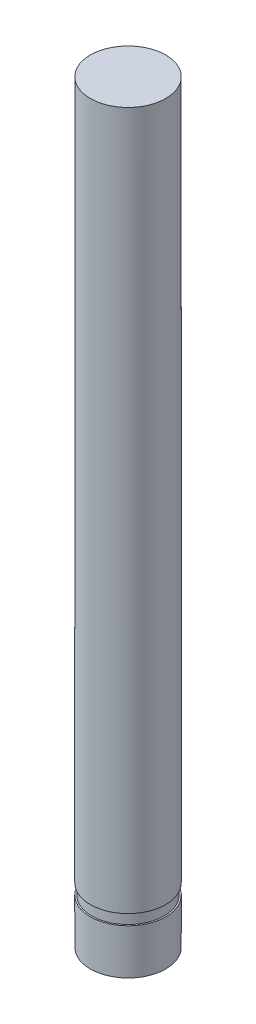
ISO-10303-21;
HEADER;
FILE_DESCRIPTION(('STEP AP214'),'2;1');
FILE_NAME('part.step','',(''),(''),'','','');
FILE_SCHEMA(('AUTOMOTIVE_DESIGN { 1 0 10303 214 1 1 1 1 }'));
ENDSEC;
DATA;
#1=APPLICATION_CONTEXT('core data for automotive mechanical design processes');
#2=APPLICATION_PROTOCOL_DEFINITION('international standard','automotive_design',2000,#1);
#3=PRODUCT_CONTEXT('',#1,'mechanical');
#4=PRODUCT('Part','Part','',(#3));
#5=PRODUCT_RELATED_PRODUCT_CATEGORY('part','',(#4));
#6=PRODUCT_DEFINITION_FORMATION('','',#4);
#7=PRODUCT_DEFINITION_CONTEXT('part definition',#1,'design');
#8=PRODUCT_DEFINITION('design','',#6,#7);
#9=PRODUCT_DEFINITION_SHAPE('','',#8);
#10=(LENGTH_UNIT() NAMED_UNIT(*) SI_UNIT(.MILLI.,.METRE.));
#11=(NAMED_UNIT(*) PLANE_ANGLE_UNIT() SI_UNIT($,.RADIAN.));
#12=(NAMED_UNIT(*) SI_UNIT($,.STERADIAN.) SOLID_ANGLE_UNIT());
#13=UNCERTAINTY_MEASURE_WITH_UNIT(LENGTH_MEASURE(1.E-05),#10,'distance_accuracy_value','');
#14=(GEOMETRIC_REPRESENTATION_CONTEXT(3) GLOBAL_UNCERTAINTY_ASSIGNED_CONTEXT((#13)) GLOBAL_UNIT_ASSIGNED_CONTEXT((#10,
#11,#12)) REPRESENTATION_CONTEXT('',''));
#15=CARTESIAN_POINT('',(0.,0.,0.));
#16=DIRECTION('',(0.,0.,1.));
#17=DIRECTION('',(1.,0.,0.));
#18=AXIS2_PLACEMENT_3D('',#15,#16,#17);
#19=CARTESIAN_POINT('',(0.,50.,0.));
#20=DIRECTION('',(0.,-1.,0.));
#21=DIRECTION('',(0.,0.,-1.));
#22=AXIS2_PLACEMENT_3D('',#19,#20,#21);
#23=CYLINDRICAL_SURFACE('',#22,2.5);
#24=CARTESIAN_POINT('',(0.,50.,0.));
#25=DIRECTION('',(0.,1.,0.));
#26=DIRECTION('',(0.,0.,1.));
#27=AXIS2_PLACEMENT_3D('',#24,#25,#26);
#28=CIRCLE('',#27,2.5);
#29=CARTESIAN_POINT('',(0.,50.,2.5));
#30=VERTEX_POINT('',#29);
#31=EDGE_CURVE('E10',#30,#30,#28,.T.);
#32=ORIENTED_EDGE('',*,*,#31,.F.);
#33=EDGE_LOOP('',(#32));
#34=FACE_BOUND('',#33,.T.);
#35=CARTESIAN_POINT('',(0.,3.700000096,0.));
#36=DIRECTION('',(0.,-1.,0.));
#37=DIRECTION('',(0.,0.,-1.));
#38=AXIS2_PLACEMENT_3D('',#35,#36,#37);
#39=CIRCLE('',#38,2.5);
#40=CARTESIAN_POINT('',(0.,3.700000096,-2.5));
#41=VERTEX_POINT('',#40);
#42=EDGE_CURVE('E54',#41,#41,#39,.T.);
#43=ORIENTED_EDGE('',*,*,#42,.F.);
#44=EDGE_LOOP('',(#43));
#45=FACE_BOUND('',#44,.T.);
#46=ADVANCED_FACE('F41',(#34,#45),#23,.T.);
#47=CARTESIAN_POINT('',(0.,50.,0.));
#48=DIRECTION('',(0.,1.,0.));
#49=DIRECTION('',(0.,0.,1.));
#50=AXIS2_PLACEMENT_3D('',#47,#48,#49);
#51=PLANE('',#50);
#52=ORIENTED_EDGE('',*,*,#31,.T.);
#53=EDGE_LOOP('',(#52));
#54=FACE_BOUND('',#53,.T.);
#55=ADVANCED_FACE('F79',(#54),#51,.T.);
#56=CARTESIAN_POINT('',(0.,3.700000096,0.));
#57=DIRECTION('',(0.,-1.,0.));
#58=DIRECTION('',(0.,0.,-1.));
#59=AXIS2_PLACEMENT_3D('',#56,#57,#58);
#60=PLANE('',#59);
#61=CARTESIAN_POINT('',(0.,3.700000096,0.));
#62=DIRECTION('',(0.,-1.,0.));
#63=DIRECTION('',(0.,0.,-1.));
#64=AXIS2_PLACEMENT_3D('',#61,#62,#63);
#65=CIRCLE('',#64,2.4);
#66=CARTESIAN_POINT('',(0.,3.700000096,-2.4));
#67=VERTEX_POINT('',#66);
#68=EDGE_CURVE('E60',#67,#67,#65,.T.);
#69=ORIENTED_EDGE('',*,*,#68,.F.);
#70=EDGE_LOOP('',(#69));
#71=FACE_BOUND('',#70,.T.);
#72=ORIENTED_EDGE('',*,*,#42,.T.);
#73=EDGE_LOOP('',(#72));
#74=FACE_BOUND('',#73,.T.);
#75=ADVANCED_FACE('F75',(#71,#74),#60,.T.);
#76=CARTESIAN_POINT('',(0.,3.000000096,0.));
#77=DIRECTION('',(0.,-1.,0.));
#78=DIRECTION('',(0.,0.,-1.));
#79=AXIS2_PLACEMENT_3D('',#76,#77,#78);
#80=PLANE('',#79);
#81=CARTESIAN_POINT('',(0.,3.000000096,0.));
#82=DIRECTION('',(0.,-1.,0.));
#83=DIRECTION('',(0.,0.,-1.));
#84=AXIS2_PLACEMENT_3D('',#81,#82,#83);
#85=CIRCLE('',#84,2.4);
#86=CARTESIAN_POINT('',(0.,3.000000096,-2.4));
#87=VERTEX_POINT('',#86);
#88=EDGE_CURVE('E64',#87,#87,#85,.T.);
#89=ORIENTED_EDGE('',*,*,#88,.T.);
#90=EDGE_LOOP('',(#89));
#91=FACE_BOUND('',#90,.T.);
#92=CARTESIAN_POINT('',(0.,3.000000096,0.));
#93=DIRECTION('',(0.,-1.,0.));
#94=DIRECTION('',(0.,0.,-1.));
#95=AXIS2_PLACEMENT_3D('',#92,#93,#94);
#96=CIRCLE('',#95,2.5);
#97=CARTESIAN_POINT('',(0.,3.000000096,-2.5));
#98=VERTEX_POINT('',#97);
#99=EDGE_CURVE('E56',#98,#98,#96,.T.);
#100=ORIENTED_EDGE('',*,*,#99,.F.);
#101=EDGE_LOOP('',(#100));
#102=FACE_BOUND('',#101,.T.);
#103=ADVANCED_FACE('F78',(#91,#102),#80,.F.);
#104=CARTESIAN_POINT('',(0.,3.700000096,0.));
#105=DIRECTION('',(0.,-1.,0.));
#106=DIRECTION('',(0.,0.,-1.));
#107=AXIS2_PLACEMENT_3D('',#104,#105,#106);
#108=CYLINDRICAL_SURFACE('',#107,2.4);
#109=ORIENTED_EDGE('',*,*,#68,.T.);
#110=EDGE_LOOP('',(#109));
#111=FACE_BOUND('',#110,.T.);
#112=ORIENTED_EDGE('',*,*,#88,.F.);
#113=EDGE_LOOP('',(#112));
#114=FACE_BOUND('',#113,.T.);
#115=ADVANCED_FACE('F72',(#111,#114),#108,.T.);
#116=CARTESIAN_POINT('',(0.,0.,0.));
#117=DIRECTION('',(0.,1.,0.));
#118=DIRECTION('',(0.,0.,1.));
#119=AXIS2_PLACEMENT_3D('',#116,#117,#118);
#120=PLANE('',#119);
#121=CARTESIAN_POINT('',(0.,0.,0.));
#122=DIRECTION('',(0.,1.,0.));
#123=DIRECTION('',(0.,0.,1.));
#124=AXIS2_PLACEMENT_3D('',#121,#122,#123);
#125=CIRCLE('',#124,2.5);
#126=CARTESIAN_POINT('',(0.,0.,2.5));
#127=VERTEX_POINT('',#126);
#128=EDGE_CURVE('E45',#127,#127,#125,.T.);
#129=ORIENTED_EDGE('',*,*,#128,.F.);
#130=EDGE_LOOP('',(#129));
#131=FACE_BOUND('',#130,.T.);
#132=ADVANCED_FACE('F90',(#131),#120,.F.);
#133=ORIENTED_EDGE('',*,*,#99,.T.);
#134=EDGE_LOOP('',(#133));
#135=FACE_BOUND('',#134,.T.);
#136=ORIENTED_EDGE('',*,*,#128,.T.);
#137=EDGE_LOOP('',(#136));
#138=FACE_BOUND('',#137,.T.);
#139=ADVANCED_FACE('F43',(#135,#138),#23,.T.);
#140=CLOSED_SHELL('',(#46,#55,#75,#103,#115,#132,#139));
#141=MANIFOLD_SOLID_BREP('B2',#140);
#142=ADVANCED_BREP_SHAPE_REPRESENTATION('',(#18,#141),#14);
#143=SHAPE_DEFINITION_REPRESENTATION(#9,#142);
ENDSEC;
END-ISO-10303-21;
